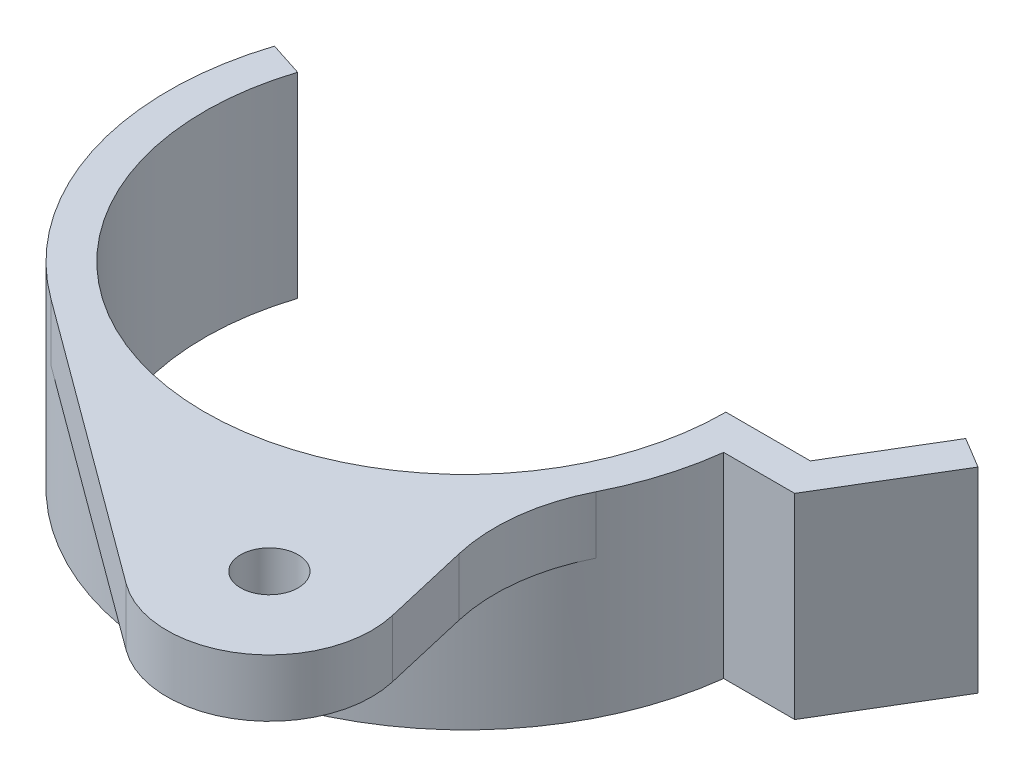
ISO-10303-21;
HEADER;
FILE_DESCRIPTION(('STEP AP214'),'2;1');
FILE_NAME('part.step','',(''),(''),'','','');
FILE_SCHEMA(('AUTOMOTIVE_DESIGN { 1 0 10303 214 1 1 1 1 }'));
ENDSEC;
DATA;
#1=APPLICATION_CONTEXT('core data for automotive mechanical design processes');
#2=APPLICATION_PROTOCOL_DEFINITION('international standard','automotive_design',2000,#1);
#3=PRODUCT_CONTEXT('',#1,'mechanical');
#4=PRODUCT('Part','Part','',(#3));
#5=PRODUCT_RELATED_PRODUCT_CATEGORY('part','',(#4));
#6=PRODUCT_DEFINITION_FORMATION('','',#4);
#7=PRODUCT_DEFINITION_CONTEXT('part definition',#1,'design');
#8=PRODUCT_DEFINITION('design','',#6,#7);
#9=PRODUCT_DEFINITION_SHAPE('','',#8);
#10=(LENGTH_UNIT() NAMED_UNIT(*) SI_UNIT(.MILLI.,.METRE.));
#11=(NAMED_UNIT(*) PLANE_ANGLE_UNIT() SI_UNIT($,.RADIAN.));
#12=(NAMED_UNIT(*) SI_UNIT($,.STERADIAN.) SOLID_ANGLE_UNIT());
#13=UNCERTAINTY_MEASURE_WITH_UNIT(LENGTH_MEASURE(1.E-05),#10,'distance_accuracy_value','');
#14=(GEOMETRIC_REPRESENTATION_CONTEXT(3) GLOBAL_UNCERTAINTY_ASSIGNED_CONTEXT((#13)) GLOBAL_UNIT_ASSIGNED_CONTEXT((#10,
#11,#12)) REPRESENTATION_CONTEXT('',''));
#15=CARTESIAN_POINT('',(0.,0.,0.));
#16=DIRECTION('',(0.,0.,1.));
#17=DIRECTION('',(1.,0.,0.));
#18=AXIS2_PLACEMENT_3D('',#15,#16,#17);
#19=CARTESIAN_POINT('',(-145.,-109.,0.));
#20=DIRECTION('',(0.,1.,0.));
#21=DIRECTION('',(0.,0.,1.));
#22=AXIS2_PLACEMENT_3D('',#19,#20,#21);
#23=CYLINDRICAL_SURFACE('',#22,145.);
#24=CARTESIAN_POINT('',(-145.,0.,0.));
#25=DIRECTION('',(0.,-1.,0.));
#26=DIRECTION('',(0.,0.,-1.));
#27=AXIS2_PLACEMENT_3D('',#24,#25,#26);
#28=CIRCLE('',#27,145.);
#29=CARTESIAN_POINT('',(0.,0.,0.));
#30=VERTEX_POINT('',#29);
#31=CARTESIAN_POINT('',(-282.957905561176,0.,-44.6387308642794));
#32=VERTEX_POINT('',#31);
#33=EDGE_CURVE('E166',#30,#32,#28,.T.);
#34=ORIENTED_EDGE('',*,*,#33,.F.);
#35=DIRECTION('',(0.,1.,0.));
#36=VECTOR('',#35,1.);
#37=CARTESIAN_POINT('',(0.,-109.,0.));
#38=LINE('',#37,#36);
#39=CARTESIAN_POINT('',(0.,-109.,0.));
#40=VERTEX_POINT('',#39);
#41=EDGE_CURVE('E216',#40,#30,#38,.T.);
#42=ORIENTED_EDGE('',*,*,#41,.F.);
#43=CARTESIAN_POINT('',(-145.,-109.,0.));
#44=DIRECTION('',(0.,-1.,0.));
#45=DIRECTION('',(0.,0.,-1.));
#46=AXIS2_PLACEMENT_3D('',#43,#44,#45);
#47=CIRCLE('',#46,145.);
#48=CARTESIAN_POINT('',(-282.957905561176,-109.,-44.6387308642794));
#49=VERTEX_POINT('',#48);
#50=EDGE_CURVE('E168',#40,#49,#47,.T.);
#51=ORIENTED_EDGE('',*,*,#50,.T.);
#52=DIRECTION('',(0.,1.,0.));
#53=VECTOR('',#52,1.);
#54=CARTESIAN_POINT('',(-282.957905561176,-109.,-44.6387308642794));
#55=LINE('',#54,#53);
#56=EDGE_CURVE('E193',#49,#32,#55,.T.);
#57=ORIENTED_EDGE('',*,*,#56,.T.);
#58=EDGE_LOOP('',(#34,#42,#51,#57));
#59=FACE_BOUND('',#58,.T.);
#60=ADVANCED_FACE('F34',(#59),#23,.F.);
#61=CARTESIAN_POINT('',(0.,-109.,0.));
#62=DIRECTION('',(0.,0.,-1.));
#63=DIRECTION('',(-1.,0.,0.));
#64=AXIS2_PLACEMENT_3D('',#61,#62,#63);
#65=PLANE('',#64);
#66=DIRECTION('',(-1.,0.,0.));
#67=VECTOR('',#66,1.);
#68=CARTESIAN_POINT('',(0.,0.,0.));
#69=LINE('',#68,#67);
#70=CARTESIAN_POINT('',(47.,0.,0.));
#71=VERTEX_POINT('',#70);
#72=EDGE_CURVE('E172',#71,#30,#69,.T.);
#73=ORIENTED_EDGE('',*,*,#72,.F.);
#74=DIRECTION('',(0.,1.,0.));
#75=VECTOR('',#74,1.);
#76=CARTESIAN_POINT('',(47.,-109.,0.));
#77=LINE('',#76,#75);
#78=CARTESIAN_POINT('',(47.,-109.,0.));
#79=VERTEX_POINT('',#78);
#80=EDGE_CURVE('E219',#79,#71,#77,.T.);
#81=ORIENTED_EDGE('',*,*,#80,.F.);
#82=DIRECTION('',(-1.,0.,0.));
#83=VECTOR('',#82,1.);
#84=CARTESIAN_POINT('',(0.,-109.,0.));
#85=LINE('',#84,#83);
#86=EDGE_CURVE('E190',#79,#40,#85,.T.);
#87=ORIENTED_EDGE('',*,*,#86,.T.);
#88=ORIENTED_EDGE('',*,*,#41,.T.);
#89=EDGE_LOOP('',(#73,#81,#87,#88));
#90=FACE_BOUND('',#89,.T.);
#91=ADVANCED_FACE('F255',(#90),#65,.T.);
#92=CARTESIAN_POINT('',(47.,-109.,0.));
#93=DIRECTION('',(-0.857167300702114,0.,-0.515038074910052));
#94=DIRECTION('',(-0.515038074910052,0.,0.857167300702114));
#95=AXIS2_PLACEMENT_3D('',#92,#93,#94);
#96=PLANE('',#95);
#97=DIRECTION('',(-0.515038074910052,0.,0.857167300702114));
#98=VECTOR('',#97,1.);
#99=CARTESIAN_POINT('',(47.,0.,0.));
#100=LINE('',#99,#98);
#101=CARTESIAN_POINT('',(79.4473987193333,0.,-54.0015399442332));
#102=VERTEX_POINT('',#101);
#103=EDGE_CURVE('E211',#102,#71,#100,.T.);
#104=ORIENTED_EDGE('',*,*,#103,.F.);
#105=DIRECTION('',(0.,1.,0.));
#106=VECTOR('',#105,1.);
#107=CARTESIAN_POINT('',(79.4473987193333,-109.,-54.0015399442332));
#108=LINE('',#107,#106);
#109=CARTESIAN_POINT('',(79.4473987193333,-109.,-54.0015399442332));
#110=VERTEX_POINT('',#109);
#111=EDGE_CURVE('E221',#110,#102,#108,.T.);
#112=ORIENTED_EDGE('',*,*,#111,.F.);
#113=DIRECTION('',(-0.515038074910052,0.,0.857167300702114));
#114=VECTOR('',#113,1.);
#115=CARTESIAN_POINT('',(47.,-109.,0.));
#116=LINE('',#115,#114);
#117=EDGE_CURVE('E187',#110,#79,#116,.T.);
#118=ORIENTED_EDGE('',*,*,#117,.T.);
#119=ORIENTED_EDGE('',*,*,#80,.T.);
#120=EDGE_LOOP('',(#104,#112,#118,#119));
#121=FACE_BOUND('',#120,.T.);
#122=ADVANCED_FACE('F260',(#121),#96,.T.);
#123=CARTESIAN_POINT('',(79.4473987193333,-109.,-54.0015399442332));
#124=DIRECTION('',(0.515038074910052,0.,-0.857167300702114));
#125=DIRECTION('',(-0.857167300702114,0.,-0.515038074910052));
#126=AXIS2_PLACEMENT_3D('',#123,#124,#125);
#127=PLANE('',#126);
#128=DIRECTION('',(-0.857167300702114,0.,-0.515038074910052));
#129=VECTOR('',#128,1.);
#130=CARTESIAN_POINT('',(79.4473987193333,0.,-54.0015399442332));
#131=LINE('',#130,#129);
#132=CARTESIAN_POINT('',(96.5907447333755,0.,-43.7007784460321));
#133=VERTEX_POINT('',#132);
#134=EDGE_CURVE('E208',#133,#102,#131,.T.);
#135=ORIENTED_EDGE('',*,*,#134,.F.);
#136=DIRECTION('',(0.,1.,0.));
#137=VECTOR('',#136,1.);
#138=CARTESIAN_POINT('',(96.5907447333755,-109.,-43.7007784460321));
#139=LINE('',#138,#137);
#140=CARTESIAN_POINT('',(96.5907447333755,-109.,-43.7007784460321));
#141=VERTEX_POINT('',#140);
#142=EDGE_CURVE('E223',#141,#133,#139,.T.);
#143=ORIENTED_EDGE('',*,*,#142,.F.);
#144=DIRECTION('',(-0.857167300702114,0.,-0.515038074910052));
#145=VECTOR('',#144,1.);
#146=CARTESIAN_POINT('',(79.4473987193333,-109.,-54.0015399442332));
#147=LINE('',#146,#145);
#148=EDGE_CURVE('E184',#141,#110,#147,.T.);
#149=ORIENTED_EDGE('',*,*,#148,.T.);
#150=ORIENTED_EDGE('',*,*,#111,.T.);
#151=EDGE_LOOP('',(#135,#143,#149,#150));
#152=FACE_BOUND('',#151,.T.);
#153=ADVANCED_FACE('F279',(#152),#127,.T.);
#154=CARTESIAN_POINT('',(58.3154555637554,-109.,20.));
#155=DIRECTION('',(0.857167300702114,0.,0.515038074910052));
#156=DIRECTION('',(0.515038074910052,0.,-0.857167300702114));
#157=AXIS2_PLACEMENT_3D('',#154,#155,#156);
#158=PLANE('',#157);
#159=DIRECTION('',(0.515038074910052,0.,-0.857167300702114));
#160=VECTOR('',#159,1.);
#161=CARTESIAN_POINT('',(58.3154555637554,0.,20.));
#162=LINE('',#161,#160);
#163=CARTESIAN_POINT('',(58.3154555637554,0.,20.));
#164=VERTEX_POINT('',#163);
#165=EDGE_CURVE('E205',#164,#133,#162,.T.);
#166=ORIENTED_EDGE('',*,*,#165,.F.);
#167=DIRECTION('',(0.,1.,0.));
#168=VECTOR('',#167,1.);
#169=CARTESIAN_POINT('',(58.3154555637554,-109.,20.));
#170=LINE('',#169,#168);
#171=CARTESIAN_POINT('',(58.3154555637554,-109.,20.));
#172=VERTEX_POINT('',#171);
#173=EDGE_CURVE('E225',#172,#164,#170,.T.);
#174=ORIENTED_EDGE('',*,*,#173,.F.);
#175=DIRECTION('',(0.515038074910052,0.,-0.857167300702114));
#176=VECTOR('',#175,1.);
#177=CARTESIAN_POINT('',(58.3154555637554,-109.,20.));
#178=LINE('',#177,#176);
#179=EDGE_CURVE('E181',#172,#141,#178,.T.);
#180=ORIENTED_EDGE('',*,*,#179,.T.);
#181=ORIENTED_EDGE('',*,*,#142,.T.);
#182=EDGE_LOOP('',(#166,#174,#180,#181));
#183=FACE_BOUND('',#182,.T.);
#184=ADVANCED_FACE('F275',(#183),#158,.T.);
#185=CARTESIAN_POINT('',(18.783393541592,-109.,20.));
#186=DIRECTION('',(0.,0.,1.));
#187=DIRECTION('',(1.,0.,0.));
#188=AXIS2_PLACEMENT_3D('',#185,#186,#187);
#189=PLANE('',#188);
#190=DIRECTION('',(1.,0.,0.));
#191=VECTOR('',#190,1.);
#192=CARTESIAN_POINT('',(18.783393541592,0.,20.));
#193=LINE('',#192,#191);
#194=CARTESIAN_POINT('',(18.783393541592,0.,20.));
#195=VERTEX_POINT('',#194);
#196=EDGE_CURVE('E202',#195,#164,#193,.T.);
#197=ORIENTED_EDGE('',*,*,#196,.F.);
#198=DIRECTION('',(0.,1.,0.));
#199=VECTOR('',#198,1.);
#200=CARTESIAN_POINT('',(18.783393541592,-109.,20.));
#201=LINE('',#200,#199);
#202=CARTESIAN_POINT('',(18.783393541592,-109.,20.));
#203=VERTEX_POINT('',#202);
#204=EDGE_CURVE('E227',#203,#195,#201,.T.);
#205=ORIENTED_EDGE('',*,*,#204,.F.);
#206=DIRECTION('',(1.,0.,0.));
#207=VECTOR('',#206,1.);
#208=CARTESIAN_POINT('',(18.783393541592,-109.,20.));
#209=LINE('',#208,#207);
#210=EDGE_CURVE('E178',#203,#172,#209,.T.);
#211=ORIENTED_EDGE('',*,*,#210,.T.);
#212=ORIENTED_EDGE('',*,*,#173,.T.);
#213=EDGE_LOOP('',(#197,#205,#211,#212));
#214=FACE_BOUND('',#213,.T.);
#215=ADVANCED_FACE('F272',(#214),#189,.T.);
#216=CARTESIAN_POINT('',(-145.,-109.,0.));
#217=DIRECTION('',(0.,1.,0.));
#218=DIRECTION('',(0.,0.,1.));
#219=AXIS2_PLACEMENT_3D('',#216,#217,#218);
#220=CYLINDRICAL_SURFACE('',#219,165.);
#221=CARTESIAN_POINT('',(-145.,0.,0.));
#222=DIRECTION('',(0.,1.,0.));
#223=DIRECTION('',(0.,0.,-1.));
#224=AXIS2_PLACEMENT_3D('',#221,#222,#223);
#225=CIRCLE('',#224,165.);
#226=CARTESIAN_POINT('',(2.18472177047624,0.,74.5765222931956));
#227=VERTEX_POINT('',#226);
#228=EDGE_CURVE('E199',#227,#195,#225,.T.);
#229=ORIENTED_EDGE('',*,*,#228,.F.);
#230=DIRECTION('',(0.,1.,0.));
#231=VECTOR('',#230,1.);
#232=CARTESIAN_POINT('',(2.18472177047624,-109.,74.5765222931956));
#233=LINE('',#232,#231);
#234=CARTESIAN_POINT('',(2.18472177047621,-32.,74.5765222931956));
#235=VERTEX_POINT('',#234);
#236=EDGE_CURVE('E147',#227,#235,#233,.F.);
#237=ORIENTED_EDGE('',*,*,#236,.T.);
#238=CARTESIAN_POINT('',(-145.,-32.,0.));
#239=DIRECTION('',(0.,-1.,0.));
#240=DIRECTION('',(0.,0.,1.));
#241=AXIS2_PLACEMENT_3D('',#238,#239,#240);
#242=CIRCLE('',#241,165.);
#243=CARTESIAN_POINT('',(-242.764114638298,-32.,132.917936671428));
#244=VERTEX_POINT('',#243);
#245=EDGE_CURVE('E48',#235,#244,#242,.T.);
#246=ORIENTED_EDGE('',*,*,#245,.T.);
#247=DIRECTION('',(0.,1.,0.));
#248=VECTOR('',#247,1.);
#249=CARTESIAN_POINT('',(-242.764114638298,-32.,132.917936671428));
#250=LINE('',#249,#248);
#251=CARTESIAN_POINT('',(-242.764114638298,0.,132.917936671428));
#252=VERTEX_POINT('',#251);
#253=EDGE_CURVE('E128',#244,#252,#250,.T.);
#254=ORIENTED_EDGE('',*,*,#253,.T.);
#255=CARTESIAN_POINT('',(-301.986582190304,0.,-50.7957971903869));
#256=VERTEX_POINT('',#255);
#257=EDGE_CURVE('E200',#256,#252,#225,.T.);
#258=ORIENTED_EDGE('',*,*,#257,.F.);
#259=DIRECTION('',(0.,1.,0.));
#260=VECTOR('',#259,1.);
#261=CARTESIAN_POINT('',(-301.986582190304,-109.,-50.7957971903869));
#262=LINE('',#261,#260);
#263=CARTESIAN_POINT('',(-301.986582190304,-109.,-50.7957971903869));
#264=VERTEX_POINT('',#263);
#265=EDGE_CURVE('E230',#264,#256,#262,.T.);
#266=ORIENTED_EDGE('',*,*,#265,.F.);
#267=CARTESIAN_POINT('',(-145.,-109.,0.));
#268=DIRECTION('',(0.,1.,0.));
#269=DIRECTION('',(0.,0.,-1.));
#270=AXIS2_PLACEMENT_3D('',#267,#268,#269);
#271=CIRCLE('',#270,165.);
#272=EDGE_CURVE('E175',#264,#203,#271,.T.);
#273=ORIENTED_EDGE('',*,*,#272,.T.);
#274=ORIENTED_EDGE('',*,*,#204,.T.);
#275=EDGE_LOOP('',(#229,#237,#246,#254,#258,#266,#273,#274));
#276=FACE_BOUND('',#275,.T.);
#277=ADVANCED_FACE('F145',(#276),#220,.T.);
#278=CARTESIAN_POINT('',(-301.986582190304,-109.,-50.7957971903869));
#279=DIRECTION('',(0.307853316305374,0.,-0.951433831456388));
#280=DIRECTION('',(-0.951433831456389,0.,-0.307853316305374));
#281=AXIS2_PLACEMENT_3D('',#278,#279,#280);
#282=PLANE('',#281);
#283=DIRECTION('',(-0.951433831456389,0.,-0.307853316305374));
#284=VECTOR('',#283,1.);
#285=CARTESIAN_POINT('',(-301.986582190304,0.,-50.7957971903869));
#286=LINE('',#285,#284);
#287=EDGE_CURVE('E196',#32,#256,#286,.T.);
#288=ORIENTED_EDGE('',*,*,#287,.F.);
#289=ORIENTED_EDGE('',*,*,#56,.F.);
#290=DIRECTION('',(-0.951433831456389,0.,-0.307853316305374));
#291=VECTOR('',#290,1.);
#292=CARTESIAN_POINT('',(-301.986582190304,-109.,-50.7957971903869));
#293=LINE('',#292,#291);
#294=EDGE_CURVE('E171',#49,#264,#293,.T.);
#295=ORIENTED_EDGE('',*,*,#294,.T.);
#296=ORIENTED_EDGE('',*,*,#265,.T.);
#297=EDGE_LOOP('',(#288,#289,#295,#296));
#298=FACE_BOUND('',#297,.T.);
#299=ADVANCED_FACE('F265',(#298),#282,.T.);
#300=CARTESIAN_POINT('',(-145.,-109.,0.));
#301=DIRECTION('',(0.,-1.,0.));
#302=DIRECTION('',(0.,0.,-1.));
#303=AXIS2_PLACEMENT_3D('',#300,#301,#302);
#304=PLANE('',#303);
#305=ORIENTED_EDGE('',*,*,#50,.F.);
#306=ORIENTED_EDGE('',*,*,#86,.F.);
#307=ORIENTED_EDGE('',*,*,#117,.F.);
#308=ORIENTED_EDGE('',*,*,#148,.F.);
#309=ORIENTED_EDGE('',*,*,#179,.F.);
#310=ORIENTED_EDGE('',*,*,#210,.F.);
#311=ORIENTED_EDGE('',*,*,#272,.F.);
#312=ORIENTED_EDGE('',*,*,#294,.F.);
#313=EDGE_LOOP('',(#305,#306,#307,#308,#309,#310,#311,#312));
#314=FACE_BOUND('',#313,.T.);
#315=ADVANCED_FACE('F268',(#314),#304,.T.);
#316=CARTESIAN_POINT('',(-145.,0.,0.));
#317=DIRECTION('',(0.,-1.,0.));
#318=DIRECTION('',(0.,0.,-1.));
#319=AXIS2_PLACEMENT_3D('',#316,#317,#318);
#320=PLANE('',#319);
#321=CARTESIAN_POINT('',(-50.2950961009997,0.,203.725259056115));
#322=DIRECTION('',(0.,1.,0.));
#323=DIRECTION('',(0.,0.,1.));
#324=AXIS2_PLACEMENT_3D('',#321,#322,#323);
#325=CIRCLE('',#324,16.);
#326=CARTESIAN_POINT('',(-50.2950961009997,0.,219.725259056115));
#327=VERTEX_POINT('',#326);
#328=EDGE_CURVE('E154',#327,#327,#325,.T.);
#329=ORIENTED_EDGE('',*,*,#328,.F.);
#330=EDGE_LOOP('',(#329));
#331=FACE_BOUND('',#330,.T.);
#332=ORIENTED_EDGE('',*,*,#33,.T.);
#333=ORIENTED_EDGE('',*,*,#287,.T.);
#334=ORIENTED_EDGE('',*,*,#257,.T.);
#335=DIRECTION('',(0.805563252554107,0.,0.592509785686657));
#336=VECTOR('',#335,1.);
#337=CARTESIAN_POINT('',(-242.764114638298,0.,132.917936671428));
#338=LINE('',#337,#336);
#339=CARTESIAN_POINT('',(-84.0681538851392,0.,249.642364451699));
#340=VERTEX_POINT('',#339);
#341=EDGE_CURVE('E132',#252,#340,#338,.T.);
#342=ORIENTED_EDGE('',*,*,#341,.T.);
#343=CARTESIAN_POINT('',(-50.2950961009997,0.,203.725259056115));
#344=DIRECTION('',(0.,1.,0.));
#345=DIRECTION('',(0.,0.,1.));
#346=AXIS2_PLACEMENT_3D('',#343,#344,#345);
#347=CIRCLE('',#346,57.);
#348=CARTESIAN_POINT('',(5.22753222200821,0.,190.831937369865));
#349=VERTEX_POINT('',#348);
#350=EDGE_CURVE('E151',#340,#349,#347,.T.);
#351=ORIENTED_EDGE('',*,*,#350,.T.);
#352=DIRECTION('',(-0.226198626074559,0.,-0.974081198649261));
#353=VECTOR('',#352,1.);
#354=CARTESIAN_POINT('',(5.22753222200823,0.,190.831937369865));
#355=LINE('',#354,#353);
#356=CARTESIAN_POINT('',(-6.02053641537341,0.,142.394277199558));
#357=VERTEX_POINT('',#356);
#358=EDGE_CURVE('E149',#349,#357,#355,.T.);
#359=ORIENTED_EDGE('',*,*,#358,.T.);
#360=CARTESIAN_POINT('',(91.3875834495527,0.,119.774414592102));
#361=DIRECTION('',(0.,-1.,0.));
#362=DIRECTION('',(0.,0.,-1.));
#363=AXIS2_PLACEMENT_3D('',#360,#361,#362);
#364=CIRCLE('',#363,100.);
#365=EDGE_CURVE('E42',#357,#227,#364,.T.);
#366=ORIENTED_EDGE('',*,*,#365,.T.);
#367=ORIENTED_EDGE('',*,*,#228,.T.);
#368=ORIENTED_EDGE('',*,*,#196,.T.);
#369=ORIENTED_EDGE('',*,*,#165,.T.);
#370=ORIENTED_EDGE('',*,*,#134,.T.);
#371=ORIENTED_EDGE('',*,*,#103,.T.);
#372=ORIENTED_EDGE('',*,*,#72,.T.);
#373=EDGE_LOOP('',(#332,#333,#334,#342,#351,#359,#366,#367,#368,#369,#370,#371,#372));
#374=FACE_BOUND('',#373,.T.);
#375=ADVANCED_FACE('F240',(#331,#374),#320,.F.);
#376=CARTESIAN_POINT('',(5.22753222200823,-32.,190.831937369865));
#377=DIRECTION('',(0.974081198649261,0.,-0.226198626074559));
#378=DIRECTION('',(-0.226198626074559,0.,-0.974081198649262));
#379=AXIS2_PLACEMENT_3D('',#376,#377,#378);
#380=PLANE('',#379);
#381=DIRECTION('',(-0.226198626074559,0.,-0.974081198649261));
#382=VECTOR('',#381,1.);
#383=CARTESIAN_POINT('',(5.22753222200823,-32.,190.831937369865));
#384=LINE('',#383,#382);
#385=CARTESIAN_POINT('',(5.22753222200821,-32.,190.831937369865));
#386=VERTEX_POINT('',#385);
#387=CARTESIAN_POINT('',(-6.02053641537341,-32.,142.394277199558));
#388=VERTEX_POINT('',#387);
#389=EDGE_CURVE('E137',#386,#388,#384,.T.);
#390=ORIENTED_EDGE('',*,*,#389,.T.);
#391=DIRECTION('',(0.,-1.,0.));
#392=VECTOR('',#391,1.);
#393=CARTESIAN_POINT('',(-6.02053641537341,0.,142.394277199558));
#394=LINE('',#393,#392);
#395=EDGE_CURVE('E218',#388,#357,#394,.F.);
#396=ORIENTED_EDGE('',*,*,#395,.T.);
#397=ORIENTED_EDGE('',*,*,#358,.F.);
#398=DIRECTION('',(0.,1.,0.));
#399=VECTOR('',#398,1.);
#400=CARTESIAN_POINT('',(5.22753222200821,-32.,190.831937369865));
#401=LINE('',#400,#399);
#402=EDGE_CURVE('E164',#386,#349,#401,.T.);
#403=ORIENTED_EDGE('',*,*,#402,.F.);
#404=EDGE_LOOP('',(#390,#396,#397,#403));
#405=FACE_BOUND('',#404,.T.);
#406=ADVANCED_FACE('F238',(#405),#380,.T.);
#407=CARTESIAN_POINT('',(-50.2950961009997,-32.,203.725259056115));
#408=DIRECTION('',(0.,1.,0.));
#409=DIRECTION('',(0.,0.,1.));
#410=AXIS2_PLACEMENT_3D('',#407,#408,#409);
#411=CYLINDRICAL_SURFACE('',#410,57.);
#412=ORIENTED_EDGE('',*,*,#350,.F.);
#413=DIRECTION('',(0.,1.,0.));
#414=VECTOR('',#413,1.);
#415=CARTESIAN_POINT('',(-84.0681538851392,-32.,249.642364451699));
#416=LINE('',#415,#414);
#417=CARTESIAN_POINT('',(-84.0681538851392,-32.,249.642364451699));
#418=VERTEX_POINT('',#417);
#419=EDGE_CURVE('E136',#418,#340,#416,.T.);
#420=ORIENTED_EDGE('',*,*,#419,.F.);
#421=CARTESIAN_POINT('',(-50.2950961009997,-32.,203.725259056115));
#422=DIRECTION('',(0.,1.,0.));
#423=DIRECTION('',(0.,0.,1.));
#424=AXIS2_PLACEMENT_3D('',#421,#422,#423);
#425=CIRCLE('',#424,57.);
#426=EDGE_CURVE('E143',#418,#386,#425,.T.);
#427=ORIENTED_EDGE('',*,*,#426,.T.);
#428=ORIENTED_EDGE('',*,*,#402,.T.);
#429=EDGE_LOOP('',(#412,#420,#427,#428));
#430=FACE_BOUND('',#429,.T.);
#431=ADVANCED_FACE('F243',(#430),#411,.T.);
#432=CARTESIAN_POINT('',(-242.764114638298,-32.,132.917936671428));
#433=DIRECTION('',(-0.592509785686657,0.,0.805563252554107));
#434=DIRECTION('',(0.805563252554107,0.,0.592509785686657));
#435=AXIS2_PLACEMENT_3D('',#432,#433,#434);
#436=PLANE('',#435);
#437=ORIENTED_EDGE('',*,*,#341,.F.);
#438=ORIENTED_EDGE('',*,*,#253,.F.);
#439=DIRECTION('',(0.805563252554107,0.,0.592509785686657));
#440=VECTOR('',#439,1.);
#441=CARTESIAN_POINT('',(-242.764114638298,-32.,132.917936671428));
#442=LINE('',#441,#440);
#443=EDGE_CURVE('E130',#244,#418,#442,.T.);
#444=ORIENTED_EDGE('',*,*,#443,.T.);
#445=ORIENTED_EDGE('',*,*,#419,.T.);
#446=EDGE_LOOP('',(#437,#438,#444,#445));
#447=FACE_BOUND('',#446,.T.);
#448=ADVANCED_FACE('F129',(#447),#436,.T.);
#449=CARTESIAN_POINT('',(-145.,-32.,0.));
#450=DIRECTION('',(0.,1.,0.));
#451=DIRECTION('',(0.,0.,1.));
#452=AXIS2_PLACEMENT_3D('',#449,#450,#451);
#453=PLANE('',#452);
#454=CARTESIAN_POINT('',(-50.2950961009997,-32.,203.725259056115));
#455=DIRECTION('',(0.,1.,0.));
#456=DIRECTION('',(0.,0.,1.));
#457=AXIS2_PLACEMENT_3D('',#454,#455,#456);
#458=CIRCLE('',#457,16.);
#459=CARTESIAN_POINT('',(-50.2950961009997,-32.,219.725259056115));
#460=VERTEX_POINT('',#459);
#461=EDGE_CURVE('E161',#460,#460,#458,.T.);
#462=ORIENTED_EDGE('',*,*,#461,.T.);
#463=EDGE_LOOP('',(#462));
#464=FACE_BOUND('',#463,.T.);
#465=ORIENTED_EDGE('',*,*,#245,.F.);
#466=CARTESIAN_POINT('',(91.3875834495527,-32.,119.774414592102));
#467=DIRECTION('',(0.,1.,0.));
#468=DIRECTION('',(0.,0.,1.));
#469=AXIS2_PLACEMENT_3D('',#466,#467,#468);
#470=CIRCLE('',#469,100.);
#471=EDGE_CURVE('E11',#235,#388,#470,.T.);
#472=ORIENTED_EDGE('',*,*,#471,.T.);
#473=ORIENTED_EDGE('',*,*,#389,.F.);
#474=ORIENTED_EDGE('',*,*,#426,.F.);
#475=ORIENTED_EDGE('',*,*,#443,.F.);
#476=EDGE_LOOP('',(#465,#472,#473,#474,#475));
#477=FACE_BOUND('',#476,.T.);
#478=ADVANCED_FACE('F140',(#464,#477),#453,.F.);
#479=CARTESIAN_POINT('',(91.3875834495527,-109.,119.774414592102));
#480=DIRECTION('',(0.,1.,0.));
#481=DIRECTION('',(0.,0.,1.));
#482=AXIS2_PLACEMENT_3D('',#479,#480,#481);
#483=CYLINDRICAL_SURFACE('',#482,100.);
#484=ORIENTED_EDGE('',*,*,#471,.F.);
#485=ORIENTED_EDGE('',*,*,#236,.F.);
#486=ORIENTED_EDGE('',*,*,#365,.F.);
#487=ORIENTED_EDGE('',*,*,#395,.F.);
#488=EDGE_LOOP('',(#484,#485,#486,#487));
#489=FACE_BOUND('',#488,.T.);
#490=ADVANCED_FACE('F36',(#489),#483,.F.);
#491=CARTESIAN_POINT('',(-50.2950961009997,-32.,203.725259056115));
#492=DIRECTION('',(0.,1.,0.));
#493=DIRECTION('',(0.,0.,1.));
#494=AXIS2_PLACEMENT_3D('',#491,#492,#493);
#495=CYLINDRICAL_SURFACE('',#494,16.);
#496=ORIENTED_EDGE('',*,*,#461,.F.);
#497=EDGE_LOOP('',(#496));
#498=FACE_BOUND('',#497,.T.);
#499=ORIENTED_EDGE('',*,*,#328,.T.);
#500=EDGE_LOOP('',(#499));
#501=FACE_BOUND('',#500,.T.);
#502=ADVANCED_FACE('F245',(#498,#501),#495,.F.);
#503=CLOSED_SHELL('',(#60,#91,#122,#153,#184,#215,#277,#299,#315,#375,#406,#431,#448,#478,#490,#502));
#504=MANIFOLD_SOLID_BREP('B2',#503);
#505=ADVANCED_BREP_SHAPE_REPRESENTATION('',(#18,#504),#14);
#506=SHAPE_DEFINITION_REPRESENTATION(#9,#505);
ENDSEC;
END-ISO-10303-21;
